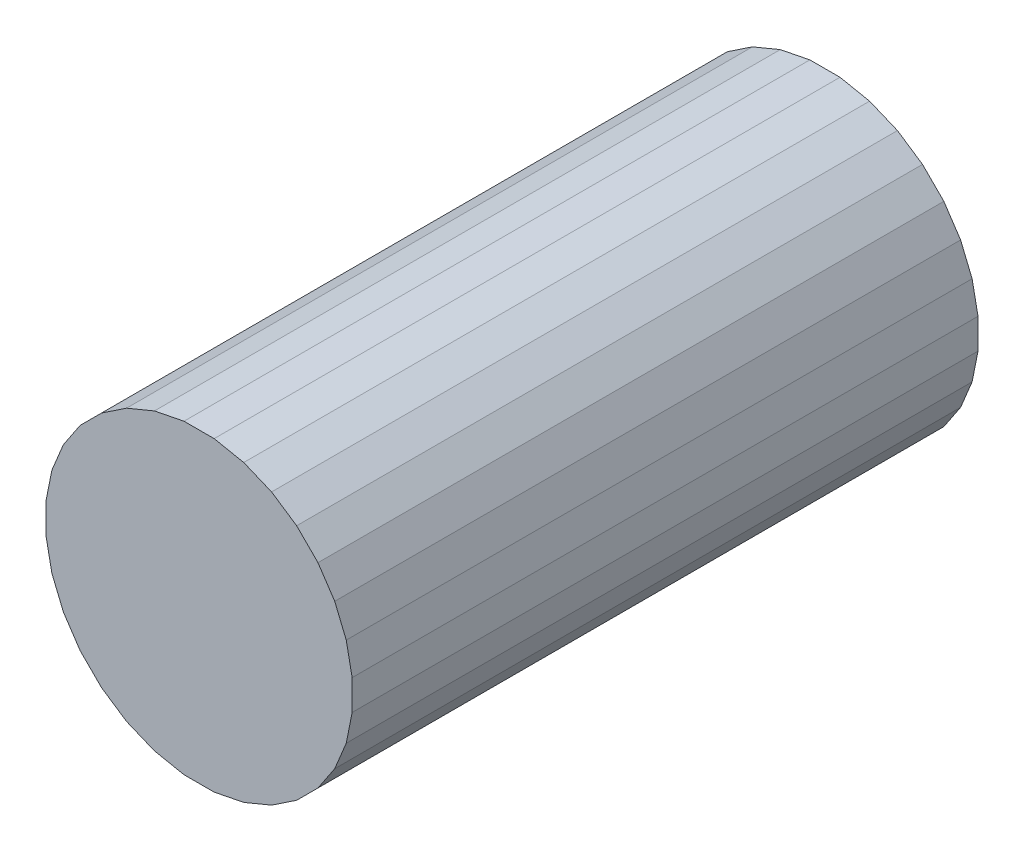
ISO-10303-21;
HEADER;
FILE_DESCRIPTION(('STEP AP214'),'2;1');
FILE_NAME('part.step','',(''),(''),'','','');
FILE_SCHEMA(('AUTOMOTIVE_DESIGN { 1 0 10303 214 1 1 1 1 }'));
ENDSEC;
DATA;
#1=APPLICATION_CONTEXT('core data for automotive mechanical design processes');
#2=APPLICATION_PROTOCOL_DEFINITION('international standard','automotive_design',2000,#1);
#3=PRODUCT_CONTEXT('',#1,'mechanical');
#4=PRODUCT('Part','Part','',(#3));
#5=PRODUCT_RELATED_PRODUCT_CATEGORY('part','',(#4));
#6=PRODUCT_DEFINITION_FORMATION('','',#4);
#7=PRODUCT_DEFINITION_CONTEXT('part definition',#1,'design');
#8=PRODUCT_DEFINITION('design','',#6,#7);
#9=PRODUCT_DEFINITION_SHAPE('','',#8);
#10=(LENGTH_UNIT() NAMED_UNIT(*) SI_UNIT(.MILLI.,.METRE.));
#11=(NAMED_UNIT(*) PLANE_ANGLE_UNIT() SI_UNIT($,.RADIAN.));
#12=(NAMED_UNIT(*) SI_UNIT($,.STERADIAN.) SOLID_ANGLE_UNIT());
#13=UNCERTAINTY_MEASURE_WITH_UNIT(LENGTH_MEASURE(1.E-05),#10,'distance_accuracy_value','');
#14=(GEOMETRIC_REPRESENTATION_CONTEXT(3) GLOBAL_UNCERTAINTY_ASSIGNED_CONTEXT((#13)) GLOBAL_UNIT_ASSIGNED_CONTEXT((#10,
#11,#12)) REPRESENTATION_CONTEXT('',''));
#15=CARTESIAN_POINT('',(0.,0.,0.));
#16=DIRECTION('',(0.,0.,1.));
#17=DIRECTION('',(1.,0.,0.));
#18=AXIS2_PLACEMENT_3D('',#15,#16,#17);
#19=CARTESIAN_POINT('',(-1.14949224,0.11321288,0.));
#20=DIRECTION('',(-0.980786364351914,0.195084872558983,0.));
#21=DIRECTION('',(-0.195084872558983,-0.980786364351914,0.));
#22=AXIS2_PLACEMENT_3D('',#19,#20,#21);
#23=PLANE('',#22);
#24=DIRECTION('',(0.,0.,1.));
#25=VECTOR('',#24,1.);
#26=CARTESIAN_POINT('',(-1.1053191,0.3352927,0.));
#27=LINE('',#26,#25);
#28=CARTESIAN_POINT('',(-1.10531909999999,0.335292699999998,0.));
#29=VERTEX_POINT('',#28);
#30=CARTESIAN_POINT('',(-1.10531909999999,0.335292699999998,4.69999822));
#31=VERTEX_POINT('',#30);
#32=EDGE_CURVE('E242',#29,#31,#27,.T.);
#33=ORIENTED_EDGE('',*,*,#32,.F.);
#34=DIRECTION('',(-0.195084872558983,-0.980786364351914,0.));
#35=VECTOR('',#34,1.);
#36=CARTESIAN_POINT('',(-1.14949224,0.11321288,0.));
#37=LINE('',#36,#35);
#38=CARTESIAN_POINT('',(-1.14949224,0.11321288,0.));
#39=VERTEX_POINT('',#38);
#40=EDGE_CURVE('E232',#29,#39,#37,.T.);
#41=ORIENTED_EDGE('',*,*,#40,.T.);
#42=DIRECTION('',(0.,0.,1.));
#43=VECTOR('',#42,1.);
#44=CARTESIAN_POINT('',(-1.14949224,0.11321288,0.));
#45=LINE('',#44,#43);
#46=CARTESIAN_POINT('',(-1.14949224,0.11321288,4.69999822));
#47=VERTEX_POINT('',#46);
#48=EDGE_CURVE('E19',#39,#47,#45,.T.);
#49=ORIENTED_EDGE('',*,*,#48,.T.);
#50=DIRECTION('',(-0.195084872558983,-0.980786364351914,0.));
#51=VECTOR('',#50,1.);
#52=CARTESIAN_POINT('',(-1.14949224,0.11321288,4.69999822));
#53=LINE('',#52,#51);
#54=EDGE_CURVE('E235',#47,#31,#53,.F.);
#55=ORIENTED_EDGE('',*,*,#54,.T.);
#56=EDGE_LOOP('',(#33,#41,#49,#55));
#57=FACE_BOUND('',#56,.T.);
#58=ADVANCED_FACE('F16',(#57),#23,.T.);
#59=CARTESIAN_POINT('',(-1.14949224,-0.11321542,0.));
#60=DIRECTION('',(-1.,0.,0.));
#61=DIRECTION('',(0.,0.,1.));
#62=AXIS2_PLACEMENT_3D('',#59,#60,#61);
#63=PLANE('',#62);
#64=DIRECTION('',(0.,1.,0.));
#65=VECTOR('',#64,1.);
#66=CARTESIAN_POINT('',(-1.14949224,-0.11321542,4.69999822));
#67=LINE('',#66,#65);
#68=CARTESIAN_POINT('',(-1.14949224,-0.113215420000001,4.69999822));
#69=VERTEX_POINT('',#68);
#70=EDGE_CURVE('E224',#69,#47,#67,.T.);
#71=ORIENTED_EDGE('',*,*,#70,.T.);
#72=ORIENTED_EDGE('',*,*,#48,.F.);
#73=DIRECTION('',(0.,1.,0.));
#74=VECTOR('',#73,1.);
#75=CARTESIAN_POINT('',(-1.14949224,-0.11321542,0.));
#76=LINE('',#75,#74);
#77=CARTESIAN_POINT('',(-1.14949224,-0.113215420000001,0.));
#78=VERTEX_POINT('',#77);
#79=EDGE_CURVE('E219',#39,#78,#76,.F.);
#80=ORIENTED_EDGE('',*,*,#79,.T.);
#81=DIRECTION('',(0.,0.,1.));
#82=VECTOR('',#81,1.);
#83=CARTESIAN_POINT('',(-1.14949224000001,-0.113215420000003,0.));
#84=LINE('',#83,#82);
#85=EDGE_CURVE('E230',#69,#78,#84,.F.);
#86=ORIENTED_EDGE('',*,*,#85,.F.);
#87=EDGE_LOOP('',(#71,#72,#80,#86));
#88=FACE_BOUND('',#87,.T.);
#89=ADVANCED_FACE('F226',(#88),#63,.T.);
#90=CARTESIAN_POINT('',(-1.1053191,0.3352927,0.));
#91=DIRECTION('',(-0.923878061104571,0.382686984635822,0.));
#92=DIRECTION('',(-0.382686984635822,-0.923878061104571,0.));
#93=AXIS2_PLACEMENT_3D('',#90,#91,#92);
#94=PLANE('',#93);
#95=DIRECTION('',(0.,0.,1.));
#96=VECTOR('',#95,1.);
#97=CARTESIAN_POINT('',(-1.018667,0.5444871,0.));
#98=LINE('',#97,#96);
#99=CARTESIAN_POINT('',(-1.01866699999997,0.544487099999989,0.));
#100=VERTEX_POINT('',#99);
#101=CARTESIAN_POINT('',(-1.01866699999997,0.544487099999989,4.69999822));
#102=VERTEX_POINT('',#101);
#103=EDGE_CURVE('E256',#100,#102,#98,.T.);
#104=ORIENTED_EDGE('',*,*,#103,.F.);
#105=DIRECTION('',(-0.382686984635822,-0.923878061104571,0.));
#106=VECTOR('',#105,1.);
#107=CARTESIAN_POINT('',(-1.1053191,0.3352927,0.));
#108=LINE('',#107,#106);
#109=EDGE_CURVE('E249',#100,#29,#108,.T.);
#110=ORIENTED_EDGE('',*,*,#109,.T.);
#111=ORIENTED_EDGE('',*,*,#32,.T.);
#112=DIRECTION('',(-0.382686984635822,-0.923878061104571,0.));
#113=VECTOR('',#112,1.);
#114=CARTESIAN_POINT('',(-1.1053191,0.3352927,4.69999822));
#115=LINE('',#114,#113);
#116=EDGE_CURVE('E238',#31,#102,#115,.F.);
#117=ORIENTED_EDGE('',*,*,#116,.T.);
#118=EDGE_LOOP('',(#104,#110,#111,#117));
#119=FACE_BOUND('',#118,.T.);
#120=ADVANCED_FACE('F537',(#119),#94,.T.);
#121=CARTESIAN_POINT('',(-1.1053191,-0.33529524,0.));
#122=DIRECTION('',(-0.980786364351914,-0.195084872558983,0.));
#123=DIRECTION('',(0.195084872558983,-0.980786364351914,0.));
#124=AXIS2_PLACEMENT_3D('',#121,#122,#123);
#125=PLANE('',#124);
#126=ORIENTED_EDGE('',*,*,#85,.T.);
#127=DIRECTION('',(0.195084872558983,-0.980786364351914,0.));
#128=VECTOR('',#127,1.);
#129=CARTESIAN_POINT('',(-1.1053191,-0.33529524,0.));
#130=LINE('',#129,#128);
#131=CARTESIAN_POINT('',(-1.10531910000001,-0.335295240000006,0.));
#132=VERTEX_POINT('',#131);
#133=EDGE_CURVE('E254',#78,#132,#130,.T.);
#134=ORIENTED_EDGE('',*,*,#133,.T.);
#135=DIRECTION('',(0.,0.,1.));
#136=VECTOR('',#135,1.);
#137=CARTESIAN_POINT('',(-1.10531910000006,-0.335295240000023,0.));
#138=LINE('',#137,#136);
#139=CARTESIAN_POINT('',(-1.10531910000001,-0.335295240000006,4.69999822));
#140=VERTEX_POINT('',#139);
#141=EDGE_CURVE('E267',#140,#132,#138,.F.);
#142=ORIENTED_EDGE('',*,*,#141,.F.);
#143=DIRECTION('',(0.195084872558983,-0.980786364351914,0.));
#144=VECTOR('',#143,1.);
#145=CARTESIAN_POINT('',(-1.1053191,-0.33529524,4.69999822));
#146=LINE('',#145,#144);
#147=EDGE_CURVE('E251',#140,#69,#146,.F.);
#148=ORIENTED_EDGE('',*,*,#147,.T.);
#149=EDGE_LOOP('',(#126,#134,#142,#148));
#150=FACE_BOUND('',#149,.T.);
#151=ADVANCED_FACE('F539',(#150),#125,.T.);
#152=CARTESIAN_POINT('',(-1.018667,0.5444871,0.));
#153=DIRECTION('',(-0.831473431321022,0.555564517412015,0.));
#154=DIRECTION('',(-0.555564517412015,-0.831473431321022,0.));
#155=AXIS2_PLACEMENT_3D('',#152,#153,#154);
#156=PLANE('',#155);
#157=DIRECTION('',(0.,0.,1.));
#158=VECTOR('',#157,1.);
#159=CARTESIAN_POINT('',(-0.89287096,0.73275698,0.));
#160=LINE('',#159,#158);
#161=CARTESIAN_POINT('',(-0.892870959999991,0.732756979999994,0.));
#162=VERTEX_POINT('',#161);
#163=CARTESIAN_POINT('',(-0.892870959999991,0.732756979999994,4.69999822));
#164=VERTEX_POINT('',#163);
#165=EDGE_CURVE('E272',#162,#164,#160,.T.);
#166=ORIENTED_EDGE('',*,*,#165,.F.);
#167=DIRECTION('',(-0.555564517412015,-0.831473431321022,0.));
#168=VECTOR('',#167,1.);
#169=CARTESIAN_POINT('',(-1.018667,0.5444871,0.));
#170=LINE('',#169,#168);
#171=EDGE_CURVE('E261',#162,#100,#170,.T.);
#172=ORIENTED_EDGE('',*,*,#171,.T.);
#173=ORIENTED_EDGE('',*,*,#103,.T.);
#174=DIRECTION('',(-0.555564517412015,-0.831473431321022,0.));
#175=VECTOR('',#174,1.);
#176=CARTESIAN_POINT('',(-1.018667,0.5444871,4.69999822));
#177=LINE('',#176,#175);
#178=EDGE_CURVE('E259',#102,#164,#177,.F.);
#179=ORIENTED_EDGE('',*,*,#178,.T.);
#180=EDGE_LOOP('',(#166,#172,#173,#179));
#181=FACE_BOUND('',#180,.T.);
#182=ADVANCED_FACE('F534',(#181),#156,.T.);
#183=CARTESIAN_POINT('',(-1.018667,-0.54448964,0.));
#184=DIRECTION('',(-0.923878061104571,-0.382686984635822,0.));
#185=DIRECTION('',(0.382686984635822,-0.923878061104571,0.));
#186=AXIS2_PLACEMENT_3D('',#183,#184,#185);
#187=PLANE('',#186);
#188=ORIENTED_EDGE('',*,*,#141,.T.);
#189=DIRECTION('',(0.382686984635822,-0.923878061104571,0.));
#190=VECTOR('',#189,1.);
#191=CARTESIAN_POINT('',(-1.018667,-0.54448964,0.));
#192=LINE('',#191,#190);
#193=CARTESIAN_POINT('',(-1.018667,-0.544489640000003,0.));
#194=VERTEX_POINT('',#193);
#195=EDGE_CURVE('E270',#132,#194,#192,.T.);
#196=ORIENTED_EDGE('',*,*,#195,.T.);
#197=DIRECTION('',(0.,0.,1.));
#198=VECTOR('',#197,1.);
#199=CARTESIAN_POINT('',(-1.01866700000002,-0.544489640000012,0.));
#200=LINE('',#199,#198);
#201=CARTESIAN_POINT('',(-1.018667,-0.544489640000003,4.69999822));
#202=VERTEX_POINT('',#201);
#203=EDGE_CURVE('E283',#202,#194,#200,.F.);
#204=ORIENTED_EDGE('',*,*,#203,.F.);
#205=DIRECTION('',(0.382686984635822,-0.923878061104571,0.));
#206=VECTOR('',#205,1.);
#207=CARTESIAN_POINT('',(-1.018667,-0.54448964,4.69999822));
#208=LINE('',#207,#206);
#209=EDGE_CURVE('E264',#202,#140,#208,.F.);
#210=ORIENTED_EDGE('',*,*,#209,.T.);
#211=EDGE_LOOP('',(#188,#196,#204,#210));
#212=FACE_BOUND('',#211,.T.);
#213=ADVANCED_FACE('F633',(#212),#187,.T.);
#214=CARTESIAN_POINT('',(-0.89287096,0.73275698,0.));
#215=DIRECTION('',(-0.707106781186548,0.707106781186548,0.));
#216=DIRECTION('',(-0.707106781186548,-0.707106781186548,0.));
#217=AXIS2_PLACEMENT_3D('',#214,#215,#216);
#218=PLANE('',#217);
#219=DIRECTION('',(0.,0.,1.));
#220=VECTOR('',#219,1.);
#221=CARTESIAN_POINT('',(-0.73275952,0.89286842,0.));
#222=LINE('',#221,#220);
#223=CARTESIAN_POINT('',(-0.73275952,0.89286842,0.));
#224=VERTEX_POINT('',#223);
#225=CARTESIAN_POINT('',(-0.73275952,0.89286842,4.69999822));
#226=VERTEX_POINT('',#225);
#227=EDGE_CURVE('E288',#224,#226,#222,.T.);
#228=ORIENTED_EDGE('',*,*,#227,.F.);
#229=DIRECTION('',(-0.707106781186548,-0.707106781186548,0.));
#230=VECTOR('',#229,1.);
#231=CARTESIAN_POINT('',(-0.89287096,0.73275698,0.));
#232=LINE('',#231,#230);
#233=EDGE_CURVE('E277',#224,#162,#232,.T.);
#234=ORIENTED_EDGE('',*,*,#233,.T.);
#235=ORIENTED_EDGE('',*,*,#165,.T.);
#236=DIRECTION('',(-0.707106781186548,-0.707106781186548,0.));
#237=VECTOR('',#236,1.);
#238=CARTESIAN_POINT('',(-0.89287096,0.73275698,4.69999822));
#239=LINE('',#238,#237);
#240=EDGE_CURVE('E275',#164,#226,#239,.F.);
#241=ORIENTED_EDGE('',*,*,#240,.T.);
#242=EDGE_LOOP('',(#228,#234,#235,#241));
#243=FACE_BOUND('',#242,.T.);
#244=ADVANCED_FACE('F531',(#243),#218,.T.);
#245=CARTESIAN_POINT('',(-0.89287096,-0.73275952,0.));
#246=DIRECTION('',(-0.831473431321022,-0.555564517412015,0.));
#247=DIRECTION('',(0.555564517412015,-0.831473431321022,0.));
#248=AXIS2_PLACEMENT_3D('',#245,#246,#247);
#249=PLANE('',#248);
#250=ORIENTED_EDGE('',*,*,#203,.T.);
#251=DIRECTION('',(0.555564517412015,-0.831473431321022,0.));
#252=VECTOR('',#251,1.);
#253=CARTESIAN_POINT('',(-0.89287096,-0.73275952,0.));
#254=LINE('',#253,#252);
#255=CARTESIAN_POINT('',(-0.89287096,-0.73275952,0.));
#256=VERTEX_POINT('',#255);
#257=EDGE_CURVE('E286',#194,#256,#254,.T.);
#258=ORIENTED_EDGE('',*,*,#257,.T.);
#259=DIRECTION('',(0.,0.,1.));
#260=VECTOR('',#259,1.);
#261=CARTESIAN_POINT('',(-0.89287096,-0.73275952,0.));
#262=LINE('',#261,#260);
#263=CARTESIAN_POINT('',(-0.89287096,-0.73275952,4.69999822));
#264=VERTEX_POINT('',#263);
#265=EDGE_CURVE('E299',#264,#256,#262,.F.);
#266=ORIENTED_EDGE('',*,*,#265,.F.);
#267=DIRECTION('',(0.555564517412015,-0.831473431321022,0.));
#268=VECTOR('',#267,1.);
#269=CARTESIAN_POINT('',(-0.89287096,-0.73275952,4.69999822));
#270=LINE('',#269,#268);
#271=EDGE_CURVE('E280',#264,#202,#270,.F.);
#272=ORIENTED_EDGE('',*,*,#271,.T.);
#273=EDGE_LOOP('',(#250,#258,#266,#272));
#274=FACE_BOUND('',#273,.T.);
#275=ADVANCED_FACE('F627',(#274),#249,.T.);
#276=CARTESIAN_POINT('',(-0.73275952,0.89286842,0.));
#277=DIRECTION('',(-0.555564517412015,0.831473431321022,0.));
#278=DIRECTION('',(-0.831473431321022,-0.555564517412015,0.));
#279=AXIS2_PLACEMENT_3D('',#276,#277,#278);
#280=PLANE('',#279);
#281=DIRECTION('',(0.,0.,1.));
#282=VECTOR('',#281,1.);
#283=CARTESIAN_POINT('',(-0.54448964,1.01866446,0.));
#284=LINE('',#283,#282);
#285=CARTESIAN_POINT('',(-0.544489640000006,1.01866446000001,0.));
#286=VERTEX_POINT('',#285);
#287=CARTESIAN_POINT('',(-0.544489640000006,1.01866446000001,4.69999822));
#288=VERTEX_POINT('',#287);
#289=EDGE_CURVE('E304',#286,#288,#284,.T.);
#290=ORIENTED_EDGE('',*,*,#289,.F.);
#291=DIRECTION('',(-0.831473431321022,-0.555564517412015,0.));
#292=VECTOR('',#291,1.);
#293=CARTESIAN_POINT('',(-0.73275952,0.89286842,0.));
#294=LINE('',#293,#292);
#295=EDGE_CURVE('E293',#286,#224,#294,.T.);
#296=ORIENTED_EDGE('',*,*,#295,.T.);
#297=ORIENTED_EDGE('',*,*,#227,.T.);
#298=DIRECTION('',(-0.831473431321022,-0.555564517412015,0.));
#299=VECTOR('',#298,1.);
#300=CARTESIAN_POINT('',(-0.73275952,0.89286842,4.69999822));
#301=LINE('',#300,#299);
#302=EDGE_CURVE('E291',#226,#288,#301,.F.);
#303=ORIENTED_EDGE('',*,*,#302,.T.);
#304=EDGE_LOOP('',(#290,#296,#297,#303));
#305=FACE_BOUND('',#304,.T.);
#306=ADVANCED_FACE('F529',(#305),#280,.T.);
#307=CARTESIAN_POINT('',(-0.73275952,-0.89287096,0.));
#308=DIRECTION('',(-0.707106781186548,-0.707106781186548,0.));
#309=DIRECTION('',(0.707106781186548,-0.707106781186548,0.));
#310=AXIS2_PLACEMENT_3D('',#307,#308,#309);
#311=PLANE('',#310);
#312=ORIENTED_EDGE('',*,*,#265,.T.);
#313=DIRECTION('',(0.707106781186548,-0.707106781186548,0.));
#314=VECTOR('',#313,1.);
#315=CARTESIAN_POINT('',(-0.73275952,-0.89287096,0.));
#316=LINE('',#315,#314);
#317=CARTESIAN_POINT('',(-0.732759519999997,-0.892870959999996,0.));
#318=VERTEX_POINT('',#317);
#319=EDGE_CURVE('E302',#256,#318,#316,.T.);
#320=ORIENTED_EDGE('',*,*,#319,.T.);
#321=DIRECTION('',(0.,0.,1.));
#322=VECTOR('',#321,1.);
#323=CARTESIAN_POINT('',(-0.732759519999988,-0.892870959999982,0.));
#324=LINE('',#323,#322);
#325=CARTESIAN_POINT('',(-0.732759519999996,-0.892870959999996,4.69999822));
#326=VERTEX_POINT('',#325);
#327=EDGE_CURVE('E315',#326,#318,#324,.F.);
#328=ORIENTED_EDGE('',*,*,#327,.F.);
#329=DIRECTION('',(0.707106781186548,-0.707106781186548,0.));
#330=VECTOR('',#329,1.);
#331=CARTESIAN_POINT('',(-0.73275952,-0.89287096,4.69999822));
#332=LINE('',#331,#330);
#333=EDGE_CURVE('E296',#326,#264,#332,.F.);
#334=ORIENTED_EDGE('',*,*,#333,.T.);
#335=EDGE_LOOP('',(#312,#320,#328,#334));
#336=FACE_BOUND('',#335,.T.);
#337=ADVANCED_FACE('F621',(#336),#311,.T.);
#338=CARTESIAN_POINT('',(-0.54448964,1.01866446,0.));
#339=DIRECTION('',(-0.382686984635822,0.923878061104571,0.));
#340=DIRECTION('',(-0.923878061104571,-0.382686984635822,0.));
#341=AXIS2_PLACEMENT_3D('',#338,#339,#340);
#342=PLANE('',#341);
#343=DIRECTION('',(0.,0.,1.));
#344=VECTOR('',#343,1.);
#345=CARTESIAN_POINT('',(-0.33529524,1.10531656,0.));
#346=LINE('',#345,#344);
#347=CARTESIAN_POINT('',(-0.335295240000012,1.10531656000003,0.));
#348=VERTEX_POINT('',#347);
#349=CARTESIAN_POINT('',(-0.335295240000012,1.10531656000003,4.69999822));
#350=VERTEX_POINT('',#349);
#351=EDGE_CURVE('E320',#348,#350,#346,.T.);
#352=ORIENTED_EDGE('',*,*,#351,.F.);
#353=DIRECTION('',(-0.923878061104571,-0.382686984635822,0.));
#354=VECTOR('',#353,1.);
#355=CARTESIAN_POINT('',(-0.54448964,1.01866446,0.));
#356=LINE('',#355,#354);
#357=EDGE_CURVE('E309',#348,#286,#356,.T.);
#358=ORIENTED_EDGE('',*,*,#357,.T.);
#359=ORIENTED_EDGE('',*,*,#289,.T.);
#360=DIRECTION('',(-0.923878061104571,-0.382686984635822,0.));
#361=VECTOR('',#360,1.);
#362=CARTESIAN_POINT('',(-0.54448964,1.01866446,4.69999822));
#363=LINE('',#362,#361);
#364=EDGE_CURVE('E307',#288,#350,#363,.F.);
#365=ORIENTED_EDGE('',*,*,#364,.T.);
#366=EDGE_LOOP('',(#352,#358,#359,#365));
#367=FACE_BOUND('',#366,.T.);
#368=ADVANCED_FACE('F524',(#367),#342,.T.);
#369=CARTESIAN_POINT('',(-0.54448964,-1.018667,0.));
#370=DIRECTION('',(-0.555564517412015,-0.831473431321022,0.));
#371=DIRECTION('',(0.831473431321022,-0.555564517412015,0.));
#372=AXIS2_PLACEMENT_3D('',#369,#370,#371);
#373=PLANE('',#372);
#374=ORIENTED_EDGE('',*,*,#327,.T.);
#375=DIRECTION('',(0.831473431321022,-0.555564517412015,0.));
#376=VECTOR('',#375,1.);
#377=CARTESIAN_POINT('',(-0.54448964,-1.018667,0.));
#378=LINE('',#377,#376);
#379=CARTESIAN_POINT('',(-0.544489639999994,-1.01866699999999,0.));
#380=VERTEX_POINT('',#379);
#381=EDGE_CURVE('E318',#318,#380,#378,.T.);
#382=ORIENTED_EDGE('',*,*,#381,.T.);
#383=DIRECTION('',(0.,0.,1.));
#384=VECTOR('',#383,1.);
#385=CARTESIAN_POINT('',(-0.544489639999977,-1.01866699999994,0.));
#386=LINE('',#385,#384);
#387=CARTESIAN_POINT('',(-0.544489639999994,-1.01866699999999,4.69999822));
#388=VERTEX_POINT('',#387);
#389=EDGE_CURVE('E332',#388,#380,#386,.F.);
#390=ORIENTED_EDGE('',*,*,#389,.F.);
#391=DIRECTION('',(0.831473431321022,-0.555564517412015,0.));
#392=VECTOR('',#391,1.);
#393=CARTESIAN_POINT('',(-0.54448964,-1.018667,4.69999822));
#394=LINE('',#393,#392);
#395=EDGE_CURVE('E312',#388,#326,#394,.F.);
#396=ORIENTED_EDGE('',*,*,#395,.T.);
#397=EDGE_LOOP('',(#374,#382,#390,#396));
#398=FACE_BOUND('',#397,.T.);
#399=ADVANCED_FACE('F615',(#398),#373,.T.);
#400=CARTESIAN_POINT('',(-0.33529524,1.10531656,0.));
#401=DIRECTION('',(-0.195095663179916,0.980784217964578,0.));
#402=DIRECTION('',(-0.980784217964578,-0.195095663179916,0.));
#403=AXIS2_PLACEMENT_3D('',#400,#401,#402);
#404=PLANE('',#403);
#405=DIRECTION('',(0.,0.,1.));
#406=VECTOR('',#405,1.);
#407=CARTESIAN_POINT('',(-0.11321542,1.14949224,0.));
#408=LINE('',#407,#406);
#409=CARTESIAN_POINT('',(-0.113215419999991,1.14949223999996,0.));
#410=VERTEX_POINT('',#409);
#411=CARTESIAN_POINT('',(-0.113215419999991,1.14949223999996,4.69999822));
#412=VERTEX_POINT('',#411);
#413=EDGE_CURVE('E337',#410,#412,#408,.T.);
#414=ORIENTED_EDGE('',*,*,#413,.F.);
#415=DIRECTION('',(-0.980784217964578,-0.195095663179916,0.));
#416=VECTOR('',#415,1.);
#417=CARTESIAN_POINT('',(-0.33529524,1.10531656,0.));
#418=LINE('',#417,#416);
#419=EDGE_CURVE('E326',#410,#348,#418,.T.);
#420=ORIENTED_EDGE('',*,*,#419,.T.);
#421=ORIENTED_EDGE('',*,*,#351,.T.);
#422=DIRECTION('',(-0.980784217964578,-0.195095663179916,0.));
#423=VECTOR('',#422,1.);
#424=CARTESIAN_POINT('',(-0.33529524,1.10531656,4.69999822));
#425=LINE('',#424,#423);
#426=EDGE_CURVE('E323',#350,#412,#425,.F.);
#427=ORIENTED_EDGE('',*,*,#426,.T.);
#428=EDGE_LOOP('',(#414,#420,#421,#427));
#429=FACE_BOUND('',#428,.T.);
#430=ADVANCED_FACE('F518',(#429),#404,.T.);
#431=CARTESIAN_POINT('',(-0.33529524,-1.1053191,0.));
#432=DIRECTION('',(-0.382686984635822,-0.923878061104571,0.));
#433=DIRECTION('',(0.923878061104571,-0.382686984635822,0.));
#434=AXIS2_PLACEMENT_3D('',#431,#432,#433);
#435=PLANE('',#434);
#436=ORIENTED_EDGE('',*,*,#389,.T.);
#437=DIRECTION('',(0.923878061104571,-0.382686984635822,0.));
#438=VECTOR('',#437,1.);
#439=CARTESIAN_POINT('',(-0.33529524,-1.1053191,0.));
#440=LINE('',#439,#438);
#441=CARTESIAN_POINT('',(-0.33529524,-1.1053191,0.));
#442=VERTEX_POINT('',#441);
#443=EDGE_CURVE('E335',#380,#442,#440,.T.);
#444=ORIENTED_EDGE('',*,*,#443,.T.);
#445=DIRECTION('',(0.,0.,1.));
#446=VECTOR('',#445,1.);
#447=CARTESIAN_POINT('',(-0.335295239999997,-1.10531909999999,0.));
#448=LINE('',#447,#446);
#449=CARTESIAN_POINT('',(-0.33529524,-1.1053191,4.69999822));
#450=VERTEX_POINT('',#449);
#451=EDGE_CURVE('E343',#450,#442,#448,.F.);
#452=ORIENTED_EDGE('',*,*,#451,.F.);
#453=DIRECTION('',(0.923878061104571,-0.382686984635822,0.));
#454=VECTOR('',#453,1.);
#455=CARTESIAN_POINT('',(-0.33529524,-1.1053191,4.69999822));
#456=LINE('',#455,#454);
#457=EDGE_CURVE('E329',#450,#388,#456,.F.);
#458=ORIENTED_EDGE('',*,*,#457,.T.);
#459=EDGE_LOOP('',(#436,#444,#452,#458));
#460=FACE_BOUND('',#459,.T.);
#461=ADVANCED_FACE('F608',(#460),#435,.T.);
#462=CARTESIAN_POINT('',(-0.11321542,-1.14949224,0.));
#463=DIRECTION('',(-0.195084872558983,-0.980786364351914,0.));
#464=DIRECTION('',(0.980786364351914,-0.195084872558983,0.));
#465=AXIS2_PLACEMENT_3D('',#462,#463,#464);
#466=PLANE('',#465);
#467=ORIENTED_EDGE('',*,*,#451,.T.);
#468=DIRECTION('',(0.980786364351914,-0.195084872558983,0.));
#469=VECTOR('',#468,1.);
#470=CARTESIAN_POINT('',(-0.11321542,-1.14949224,0.));
#471=LINE('',#470,#469);
#472=CARTESIAN_POINT('',(-0.11321542,-1.14949224,0.));
#473=VERTEX_POINT('',#472);
#474=EDGE_CURVE('E346',#442,#473,#471,.T.);
#475=ORIENTED_EDGE('',*,*,#474,.T.);
#476=DIRECTION('',(0.,0.,-1.));
#477=VECTOR('',#476,1.);
#478=CARTESIAN_POINT('',(-0.11321542,-1.14949224,0.));
#479=LINE('',#478,#477);
#480=CARTESIAN_POINT('',(-0.113215420000001,-1.14949224,4.69999822));
#481=VERTEX_POINT('',#480);
#482=EDGE_CURVE('E353',#481,#473,#479,.T.);
#483=ORIENTED_EDGE('',*,*,#482,.F.);
#484=DIRECTION('',(0.980786364351914,-0.195084872558983,0.));
#485=VECTOR('',#484,1.);
#486=CARTESIAN_POINT('',(-0.11321542,-1.14949224,4.69999822));
#487=LINE('',#486,#485);
#488=EDGE_CURVE('E340',#481,#450,#487,.F.);
#489=ORIENTED_EDGE('',*,*,#488,.T.);
#490=EDGE_LOOP('',(#467,#475,#483,#489));
#491=FACE_BOUND('',#490,.T.);
#492=ADVANCED_FACE('F605',(#491),#466,.T.);
#493=CARTESIAN_POINT('',(0.,1.14949224,0.));
#494=DIRECTION('',(0.,1.,0.));
#495=DIRECTION('',(0.,0.,1.));
#496=AXIS2_PLACEMENT_3D('',#493,#494,#495);
#497=PLANE('',#496);
#498=DIRECTION('',(0.,0.,1.));
#499=VECTOR('',#498,1.);
#500=CARTESIAN_POINT('',(0.11321288,1.14949224,0.));
#501=LINE('',#500,#499);
#502=CARTESIAN_POINT('',(0.11321288,1.14949224,0.));
#503=VERTEX_POINT('',#502);
#504=CARTESIAN_POINT('',(0.11321288,1.14949224,4.69999822));
#505=VERTEX_POINT('',#504);
#506=EDGE_CURVE('E356',#503,#505,#501,.T.);
#507=ORIENTED_EDGE('',*,*,#506,.F.);
#508=DIRECTION('',(1.,0.,0.));
#509=VECTOR('',#508,1.);
#510=CARTESIAN_POINT('',(0.,1.14949224,0.));
#511=LINE('',#510,#509);
#512=EDGE_CURVE('E351',#503,#410,#511,.F.);
#513=ORIENTED_EDGE('',*,*,#512,.T.);
#514=ORIENTED_EDGE('',*,*,#413,.T.);
#515=DIRECTION('',(1.,0.,0.));
#516=VECTOR('',#515,1.);
#517=CARTESIAN_POINT('',(0.,1.14949224,4.69999822));
#518=LINE('',#517,#516);
#519=EDGE_CURVE('E349',#412,#505,#518,.T.);
#520=ORIENTED_EDGE('',*,*,#519,.T.);
#521=EDGE_LOOP('',(#507,#513,#514,#520));
#522=FACE_BOUND('',#521,.T.);
#523=ADVANCED_FACE('F520',(#522),#497,.T.);
#524=CARTESIAN_POINT('',(0.11321288,1.14949224,0.));
#525=DIRECTION('',(0.195095663179916,0.980784217964578,0.));
#526=DIRECTION('',(-0.980784217964578,0.195095663179916,0.));
#527=AXIS2_PLACEMENT_3D('',#524,#525,#526);
#528=PLANE('',#527);
#529=DIRECTION('',(0.,0.,1.));
#530=VECTOR('',#529,1.);
#531=CARTESIAN_POINT('',(0.3352927,1.10531656,0.));
#532=LINE('',#531,#530);
#533=CARTESIAN_POINT('',(0.335292700000008,1.10531656000004,0.));
#534=VERTEX_POINT('',#533);
#535=CARTESIAN_POINT('',(0.335292700000008,1.10531656000004,4.69999822));
#536=VERTEX_POINT('',#535);
#537=EDGE_CURVE('E368',#534,#536,#532,.T.);
#538=ORIENTED_EDGE('',*,*,#537,.F.);
#539=DIRECTION('',(-0.980784217964578,0.195095663179916,0.));
#540=VECTOR('',#539,1.);
#541=CARTESIAN_POINT('',(0.11321288,1.14949224,0.));
#542=LINE('',#541,#540);
#543=EDGE_CURVE('E361',#534,#503,#542,.T.);
#544=ORIENTED_EDGE('',*,*,#543,.T.);
#545=ORIENTED_EDGE('',*,*,#506,.T.);
#546=DIRECTION('',(-0.980784217964578,0.195095663179916,0.));
#547=VECTOR('',#546,1.);
#548=CARTESIAN_POINT('',(0.11321288,1.14949224,4.69999822));
#549=LINE('',#548,#547);
#550=EDGE_CURVE('E359',#505,#536,#549,.F.);
#551=ORIENTED_EDGE('',*,*,#550,.T.);
#552=EDGE_LOOP('',(#538,#544,#545,#551));
#553=FACE_BOUND('',#552,.T.);
#554=ADVANCED_FACE('F511',(#553),#528,.T.);
#555=CARTESIAN_POINT('',(0.11321288,-1.14949224,0.));
#556=DIRECTION('',(0.,-1.,0.));
#557=DIRECTION('',(0.,0.,-1.));
#558=AXIS2_PLACEMENT_3D('',#555,#556,#557);
#559=PLANE('',#558);
#560=DIRECTION('',(1.,0.,0.));
#561=VECTOR('',#560,1.);
#562=CARTESIAN_POINT('',(0.11321288,-1.14949224,4.69999822));
#563=LINE('',#562,#561);
#564=CARTESIAN_POINT('',(0.113212879999996,-1.14949224,4.69999822));
#565=VERTEX_POINT('',#564);
#566=EDGE_CURVE('E364',#565,#481,#563,.F.);
#567=ORIENTED_EDGE('',*,*,#566,.T.);
#568=ORIENTED_EDGE('',*,*,#482,.T.);
#569=DIRECTION('',(1.,0.,0.));
#570=VECTOR('',#569,1.);
#571=CARTESIAN_POINT('',(0.11321288,-1.14949224,0.));
#572=LINE('',#571,#570);
#573=CARTESIAN_POINT('',(0.113212879999999,-1.14949224,0.));
#574=VERTEX_POINT('',#573);
#575=EDGE_CURVE('E366',#473,#574,#572,.T.);
#576=ORIENTED_EDGE('',*,*,#575,.T.);
#577=DIRECTION('',(0.,0.,1.));
#578=VECTOR('',#577,1.);
#579=CARTESIAN_POINT('',(0.113212880000003,-1.14949224000001,0.));
#580=LINE('',#579,#578);
#581=EDGE_CURVE('E379',#565,#574,#580,.F.);
#582=ORIENTED_EDGE('',*,*,#581,.F.);
#583=EDGE_LOOP('',(#567,#568,#576,#582));
#584=FACE_BOUND('',#583,.T.);
#585=ADVANCED_FACE('F597',(#584),#559,.T.);
#586=CARTESIAN_POINT('',(0.3352927,1.10531656,0.));
#587=DIRECTION('',(0.382686984635822,0.923878061104571,0.));
#588=DIRECTION('',(-0.923878061104571,0.382686984635822,0.));
#589=AXIS2_PLACEMENT_3D('',#586,#587,#588);
#590=PLANE('',#589);
#591=DIRECTION('',(0.,0.,1.));
#592=VECTOR('',#591,1.);
#593=CARTESIAN_POINT('',(0.5444871,1.01866446,0.));
#594=LINE('',#593,#592);
#595=CARTESIAN_POINT('',(0.544487099999989,1.01866445999997,0.));
#596=VERTEX_POINT('',#595);
#597=CARTESIAN_POINT('',(0.544487099999989,1.01866445999997,4.69999822));
#598=VERTEX_POINT('',#597);
#599=EDGE_CURVE('E384',#596,#598,#594,.T.);
#600=ORIENTED_EDGE('',*,*,#599,.F.);
#601=DIRECTION('',(-0.923878061104571,0.382686984635822,0.));
#602=VECTOR('',#601,1.);
#603=CARTESIAN_POINT('',(0.3352927,1.10531656,0.));
#604=LINE('',#603,#602);
#605=EDGE_CURVE('E373',#596,#534,#604,.T.);
#606=ORIENTED_EDGE('',*,*,#605,.T.);
#607=ORIENTED_EDGE('',*,*,#537,.T.);
#608=DIRECTION('',(-0.923878061104571,0.382686984635822,0.));
#609=VECTOR('',#608,1.);
#610=CARTESIAN_POINT('',(0.3352927,1.10531656,4.69999822));
#611=LINE('',#610,#609);
#612=EDGE_CURVE('E371',#536,#598,#611,.F.);
#613=ORIENTED_EDGE('',*,*,#612,.T.);
#614=EDGE_LOOP('',(#600,#606,#607,#613));
#615=FACE_BOUND('',#614,.T.);
#616=ADVANCED_FACE('F508',(#615),#590,.T.);
#617=CARTESIAN_POINT('',(0.3352927,-1.1053191,0.));
#618=DIRECTION('',(0.195084872558983,-0.980786364351914,0.));
#619=DIRECTION('',(0.980786364351914,0.195084872558983,0.));
#620=AXIS2_PLACEMENT_3D('',#617,#618,#619);
#621=PLANE('',#620);
#622=ORIENTED_EDGE('',*,*,#581,.T.);
#623=DIRECTION('',(0.980786364351914,0.195084872558983,0.));
#624=VECTOR('',#623,1.);
#625=CARTESIAN_POINT('',(0.3352927,-1.1053191,0.));
#626=LINE('',#625,#624);
#627=CARTESIAN_POINT('',(0.335292700000006,-1.10531910000001,0.));
#628=VERTEX_POINT('',#627);
#629=EDGE_CURVE('E382',#574,#628,#626,.T.);
#630=ORIENTED_EDGE('',*,*,#629,.T.);
#631=DIRECTION('',(0.,0.,1.));
#632=VECTOR('',#631,1.);
#633=CARTESIAN_POINT('',(0.335292700000023,-1.10531910000006,0.));
#634=LINE('',#633,#632);
#635=CARTESIAN_POINT('',(0.335292700000006,-1.10531910000001,4.69999822));
#636=VERTEX_POINT('',#635);
#637=EDGE_CURVE('E395',#636,#628,#634,.F.);
#638=ORIENTED_EDGE('',*,*,#637,.F.);
#639=DIRECTION('',(0.980786364351914,0.195084872558983,0.));
#640=VECTOR('',#639,1.);
#641=CARTESIAN_POINT('',(0.3352927,-1.1053191,4.69999822));
#642=LINE('',#641,#640);
#643=EDGE_CURVE('E376',#636,#565,#642,.F.);
#644=ORIENTED_EDGE('',*,*,#643,.T.);
#645=EDGE_LOOP('',(#622,#630,#638,#644));
#646=FACE_BOUND('',#645,.T.);
#647=ADVANCED_FACE('F591',(#646),#621,.T.);
#648=CARTESIAN_POINT('',(0.5444871,1.01866446,0.));
#649=DIRECTION('',(0.555564517412015,0.831473431321022,0.));
#650=DIRECTION('',(-0.831473431321022,0.555564517412015,0.));
#651=AXIS2_PLACEMENT_3D('',#648,#649,#650);
#652=PLANE('',#651);
#653=DIRECTION('',(0.,0.,1.));
#654=VECTOR('',#653,1.);
#655=CARTESIAN_POINT('',(0.73275698,0.89286842,0.));
#656=LINE('',#655,#654);
#657=CARTESIAN_POINT('',(0.732756979999994,0.892868419999991,0.));
#658=VERTEX_POINT('',#657);
#659=CARTESIAN_POINT('',(0.732756979999994,0.892868419999991,4.69999822));
#660=VERTEX_POINT('',#659);
#661=EDGE_CURVE('E400',#658,#660,#656,.T.);
#662=ORIENTED_EDGE('',*,*,#661,.F.);
#663=DIRECTION('',(-0.831473431321022,0.555564517412015,0.));
#664=VECTOR('',#663,1.);
#665=CARTESIAN_POINT('',(0.5444871,1.01866446,0.));
#666=LINE('',#665,#664);
#667=EDGE_CURVE('E389',#658,#596,#666,.T.);
#668=ORIENTED_EDGE('',*,*,#667,.T.);
#669=ORIENTED_EDGE('',*,*,#599,.T.);
#670=DIRECTION('',(-0.831473431321022,0.555564517412015,0.));
#671=VECTOR('',#670,1.);
#672=CARTESIAN_POINT('',(0.5444871,1.01866446,4.69999822));
#673=LINE('',#672,#671);
#674=EDGE_CURVE('E387',#598,#660,#673,.F.);
#675=ORIENTED_EDGE('',*,*,#674,.T.);
#676=EDGE_LOOP('',(#662,#668,#669,#675));
#677=FACE_BOUND('',#676,.T.);
#678=ADVANCED_FACE('F506',(#677),#652,.T.);
#679=CARTESIAN_POINT('',(0.5444871,-1.018667,0.));
#680=DIRECTION('',(0.382686984635822,-0.923878061104571,0.));
#681=DIRECTION('',(0.923878061104571,0.382686984635822,0.));
#682=AXIS2_PLACEMENT_3D('',#679,#680,#681);
#683=PLANE('',#682);
#684=ORIENTED_EDGE('',*,*,#637,.T.);
#685=DIRECTION('',(0.923878061104571,0.382686984635822,0.));
#686=VECTOR('',#685,1.);
#687=CARTESIAN_POINT('',(0.5444871,-1.018667,0.));
#688=LINE('',#687,#686);
#689=CARTESIAN_POINT('',(0.544487100000003,-1.018667,0.));
#690=VERTEX_POINT('',#689);
#691=EDGE_CURVE('E398',#628,#690,#688,.T.);
#692=ORIENTED_EDGE('',*,*,#691,.T.);
#693=DIRECTION('',(0.,0.,1.));
#694=VECTOR('',#693,1.);
#695=CARTESIAN_POINT('',(0.544487100000012,-1.01866700000002,0.));
#696=LINE('',#695,#694);
#697=CARTESIAN_POINT('',(0.544487100000004,-1.018667,4.69999822));
#698=VERTEX_POINT('',#697);
#699=EDGE_CURVE('E411',#698,#690,#696,.F.);
#700=ORIENTED_EDGE('',*,*,#699,.F.);
#701=DIRECTION('',(0.923878061104571,0.382686984635822,0.));
#702=VECTOR('',#701,1.);
#703=CARTESIAN_POINT('',(0.5444871,-1.018667,4.69999822));
#704=LINE('',#703,#702);
#705=EDGE_CURVE('E392',#698,#636,#704,.F.);
#706=ORIENTED_EDGE('',*,*,#705,.T.);
#707=EDGE_LOOP('',(#684,#692,#700,#706));
#708=FACE_BOUND('',#707,.T.);
#709=ADVANCED_FACE('F585',(#708),#683,.T.);
#710=CARTESIAN_POINT('',(0.73275698,0.89286842,0.));
#711=DIRECTION('',(0.707106781186548,0.707106781186548,0.));
#712=DIRECTION('',(-0.707106781186548,0.707106781186548,0.));
#713=AXIS2_PLACEMENT_3D('',#710,#711,#712);
#714=PLANE('',#713);
#715=DIRECTION('',(0.,0.,1.));
#716=VECTOR('',#715,1.);
#717=CARTESIAN_POINT('',(0.89286842,0.73275698,0.));
#718=LINE('',#717,#716);
#719=CARTESIAN_POINT('',(0.89286842,0.73275698,0.));
#720=VERTEX_POINT('',#719);
#721=CARTESIAN_POINT('',(0.89286842,0.73275698,4.69999822));
#722=VERTEX_POINT('',#721);
#723=EDGE_CURVE('E416',#720,#722,#718,.T.);
#724=ORIENTED_EDGE('',*,*,#723,.F.);
#725=DIRECTION('',(-0.707106781186548,0.707106781186548,0.));
#726=VECTOR('',#725,1.);
#727=CARTESIAN_POINT('',(0.73275698,0.89286842,0.));
#728=LINE('',#727,#726);
#729=EDGE_CURVE('E405',#720,#658,#728,.T.);
#730=ORIENTED_EDGE('',*,*,#729,.T.);
#731=ORIENTED_EDGE('',*,*,#661,.T.);
#732=DIRECTION('',(-0.707106781186548,0.707106781186548,0.));
#733=VECTOR('',#732,1.);
#734=CARTESIAN_POINT('',(0.73275698,0.89286842,4.69999822));
#735=LINE('',#734,#733);
#736=EDGE_CURVE('E403',#660,#722,#735,.F.);
#737=ORIENTED_EDGE('',*,*,#736,.T.);
#738=EDGE_LOOP('',(#724,#730,#731,#737));
#739=FACE_BOUND('',#738,.T.);
#740=ADVANCED_FACE('F499',(#739),#714,.T.);
#741=CARTESIAN_POINT('',(0.73275698,-0.89287096,0.));
#742=DIRECTION('',(0.555564517412015,-0.831473431321022,0.));
#743=DIRECTION('',(0.831473431321022,0.555564517412015,0.));
#744=AXIS2_PLACEMENT_3D('',#741,#742,#743);
#745=PLANE('',#744);
#746=ORIENTED_EDGE('',*,*,#699,.T.);
#747=DIRECTION('',(0.831473431321022,0.555564517412015,0.));
#748=VECTOR('',#747,1.);
#749=CARTESIAN_POINT('',(0.73275698,-0.89287096,0.));
#750=LINE('',#749,#748);
#751=CARTESIAN_POINT('',(0.73275698,-0.89287096,0.));
#752=VERTEX_POINT('',#751);
#753=EDGE_CURVE('E414',#690,#752,#750,.T.);
#754=ORIENTED_EDGE('',*,*,#753,.T.);
#755=DIRECTION('',(0.,0.,1.));
#756=VECTOR('',#755,1.);
#757=CARTESIAN_POINT('',(0.73275698,-0.89287096,0.));
#758=LINE('',#757,#756);
#759=CARTESIAN_POINT('',(0.73275698,-0.89287096,4.69999822));
#760=VERTEX_POINT('',#759);
#761=EDGE_CURVE('E427',#760,#752,#758,.F.);
#762=ORIENTED_EDGE('',*,*,#761,.F.);
#763=DIRECTION('',(0.831473431321022,0.555564517412015,0.));
#764=VECTOR('',#763,1.);
#765=CARTESIAN_POINT('',(0.73275698,-0.89287096,4.69999822));
#766=LINE('',#765,#764);
#767=EDGE_CURVE('E408',#760,#698,#766,.F.);
#768=ORIENTED_EDGE('',*,*,#767,.T.);
#769=EDGE_LOOP('',(#746,#754,#762,#768));
#770=FACE_BOUND('',#769,.T.);
#771=ADVANCED_FACE('F579',(#770),#745,.T.);
#772=CARTESIAN_POINT('',(0.89286842,0.73275698,0.));
#773=DIRECTION('',(0.831473431321022,0.555564517412015,0.));
#774=DIRECTION('',(-0.555564517412015,0.831473431321022,0.));
#775=AXIS2_PLACEMENT_3D('',#772,#773,#774);
#776=PLANE('',#775);
#777=DIRECTION('',(0.,0.,1.));
#778=VECTOR('',#777,1.);
#779=CARTESIAN_POINT('',(1.01866446,0.5444871,0.));
#780=LINE('',#779,#778);
#781=CARTESIAN_POINT('',(1.01866446000001,0.544487100000006,0.));
#782=VERTEX_POINT('',#781);
#783=CARTESIAN_POINT('',(1.01866446000001,0.544487100000006,4.69999822));
#784=VERTEX_POINT('',#783);
#785=EDGE_CURVE('E432',#782,#784,#780,.T.);
#786=ORIENTED_EDGE('',*,*,#785,.F.);
#787=DIRECTION('',(-0.555564517412015,0.831473431321022,0.));
#788=VECTOR('',#787,1.);
#789=CARTESIAN_POINT('',(0.89286842,0.73275698,0.));
#790=LINE('',#789,#788);
#791=EDGE_CURVE('E421',#782,#720,#790,.T.);
#792=ORIENTED_EDGE('',*,*,#791,.T.);
#793=ORIENTED_EDGE('',*,*,#723,.T.);
#794=DIRECTION('',(-0.555564517412015,0.831473431321022,0.));
#795=VECTOR('',#794,1.);
#796=CARTESIAN_POINT('',(0.89286842,0.73275698,4.69999822));
#797=LINE('',#796,#795);
#798=EDGE_CURVE('E419',#722,#784,#797,.F.);
#799=ORIENTED_EDGE('',*,*,#798,.T.);
#800=EDGE_LOOP('',(#786,#792,#793,#799));
#801=FACE_BOUND('',#800,.T.);
#802=ADVANCED_FACE('F496',(#801),#776,.T.);
#803=CARTESIAN_POINT('',(0.89286842,-0.73275952,0.));
#804=DIRECTION('',(0.707106781186548,-0.707106781186548,0.));
#805=DIRECTION('',(0.707106781186548,0.707106781186548,0.));
#806=AXIS2_PLACEMENT_3D('',#803,#804,#805);
#807=PLANE('',#806);
#808=ORIENTED_EDGE('',*,*,#761,.T.);
#809=DIRECTION('',(0.707106781186548,0.707106781186548,0.));
#810=VECTOR('',#809,1.);
#811=CARTESIAN_POINT('',(0.89286842,-0.73275952,0.));
#812=LINE('',#811,#810);
#813=CARTESIAN_POINT('',(0.892868419999996,-0.732759519999997,0.));
#814=VERTEX_POINT('',#813);
#815=EDGE_CURVE('E430',#752,#814,#812,.T.);
#816=ORIENTED_EDGE('',*,*,#815,.T.);
#817=DIRECTION('',(0.,0.,1.));
#818=VECTOR('',#817,1.);
#819=CARTESIAN_POINT('',(0.892868419999982,-0.732759519999988,0.));
#820=LINE('',#819,#818);
#821=CARTESIAN_POINT('',(0.892868419999996,-0.732759519999996,4.69999822));
#822=VERTEX_POINT('',#821);
#823=EDGE_CURVE('E443',#822,#814,#820,.F.);
#824=ORIENTED_EDGE('',*,*,#823,.F.);
#825=DIRECTION('',(0.707106781186548,0.707106781186548,0.));
#826=VECTOR('',#825,1.);
#827=CARTESIAN_POINT('',(0.89286842,-0.73275952,4.69999822));
#828=LINE('',#827,#826);
#829=EDGE_CURVE('E424',#822,#760,#828,.F.);
#830=ORIENTED_EDGE('',*,*,#829,.T.);
#831=EDGE_LOOP('',(#808,#816,#824,#830));
#832=FACE_BOUND('',#831,.T.);
#833=ADVANCED_FACE('F573',(#832),#807,.T.);
#834=CARTESIAN_POINT('',(1.01866446,0.5444871,0.));
#835=DIRECTION('',(0.923878061104571,0.382686984635822,0.));
#836=DIRECTION('',(-0.382686984635822,0.923878061104571,0.));
#837=AXIS2_PLACEMENT_3D('',#834,#835,#836);
#838=PLANE('',#837);
#839=DIRECTION('',(0.,0.,1.));
#840=VECTOR('',#839,1.);
#841=CARTESIAN_POINT('',(1.10531656,0.3352927,0.));
#842=LINE('',#841,#840);
#843=CARTESIAN_POINT('',(1.10531656000003,0.335292700000011,0.));
#844=VERTEX_POINT('',#843);
#845=CARTESIAN_POINT('',(1.10531656000003,0.335292700000011,4.69999822));
#846=VERTEX_POINT('',#845);
#847=EDGE_CURVE('E448',#844,#846,#842,.T.);
#848=ORIENTED_EDGE('',*,*,#847,.F.);
#849=DIRECTION('',(-0.382686984635822,0.923878061104571,0.));
#850=VECTOR('',#849,1.);
#851=CARTESIAN_POINT('',(1.01866446,0.5444871,0.));
#852=LINE('',#851,#850);
#853=EDGE_CURVE('E437',#844,#782,#852,.T.);
#854=ORIENTED_EDGE('',*,*,#853,.T.);
#855=ORIENTED_EDGE('',*,*,#785,.T.);
#856=DIRECTION('',(-0.382686984635822,0.923878061104571,0.));
#857=VECTOR('',#856,1.);
#858=CARTESIAN_POINT('',(1.01866446,0.5444871,4.69999822));
#859=LINE('',#858,#857);
#860=EDGE_CURVE('E435',#784,#846,#859,.F.);
#861=ORIENTED_EDGE('',*,*,#860,.T.);
#862=EDGE_LOOP('',(#848,#854,#855,#861));
#863=FACE_BOUND('',#862,.T.);
#864=ADVANCED_FACE('F494',(#863),#838,.T.);
#865=CARTESIAN_POINT('',(1.01866446,-0.54448964,0.));
#866=DIRECTION('',(0.831473431321022,-0.555564517412015,0.));
#867=DIRECTION('',(0.555564517412015,0.831473431321022,0.));
#868=AXIS2_PLACEMENT_3D('',#865,#866,#867);
#869=PLANE('',#868);
#870=ORIENTED_EDGE('',*,*,#823,.T.);
#871=DIRECTION('',(0.555564517412015,0.831473431321022,0.));
#872=VECTOR('',#871,1.);
#873=CARTESIAN_POINT('',(1.01866446,-0.54448964,0.));
#874=LINE('',#873,#872);
#875=CARTESIAN_POINT('',(1.01866445999999,-0.544489639999995,0.));
#876=VERTEX_POINT('',#875);
#877=EDGE_CURVE('E446',#814,#876,#874,.T.);
#878=ORIENTED_EDGE('',*,*,#877,.T.);
#879=DIRECTION('',(0.,0.,1.));
#880=VECTOR('',#879,1.);
#881=CARTESIAN_POINT('',(1.01866445999994,-0.544489639999977,0.));
#882=LINE('',#881,#880);
#883=CARTESIAN_POINT('',(1.01866445999999,-0.544489639999995,4.69999822));
#884=VERTEX_POINT('',#883);
#885=EDGE_CURVE('E460',#884,#876,#882,.F.);
#886=ORIENTED_EDGE('',*,*,#885,.F.);
#887=DIRECTION('',(0.555564517412015,0.831473431321022,0.));
#888=VECTOR('',#887,1.);
#889=CARTESIAN_POINT('',(1.01866446,-0.54448964,4.69999822));
#890=LINE('',#889,#888);
#891=EDGE_CURVE('E440',#884,#822,#890,.F.);
#892=ORIENTED_EDGE('',*,*,#891,.T.);
#893=EDGE_LOOP('',(#870,#878,#886,#892));
#894=FACE_BOUND('',#893,.T.);
#895=ADVANCED_FACE('F567',(#894),#869,.T.);
#896=CARTESIAN_POINT('',(1.10531656,0.3352927,0.));
#897=DIRECTION('',(0.980784217964578,0.195095663179916,0.));
#898=DIRECTION('',(-0.195095663179916,0.980784217964578,0.));
#899=AXIS2_PLACEMENT_3D('',#896,#897,#898);
#900=PLANE('',#899);
#901=DIRECTION('',(0.,0.,-1.));
#902=VECTOR('',#901,1.);
#903=CARTESIAN_POINT('',(1.14949224,0.11321288,0.));
#904=LINE('',#903,#902);
#905=CARTESIAN_POINT('',(1.14949223999996,0.113212879999992,0.));
#906=VERTEX_POINT('',#905);
#907=CARTESIAN_POINT('',(1.14949223999996,0.113212879999992,4.69999822));
#908=VERTEX_POINT('',#907);
#909=EDGE_CURVE('E465',#906,#908,#904,.F.);
#910=ORIENTED_EDGE('',*,*,#909,.F.);
#911=DIRECTION('',(-0.195095663179916,0.980784217964578,0.));
#912=VECTOR('',#911,1.);
#913=CARTESIAN_POINT('',(1.10531656,0.3352927,0.));
#914=LINE('',#913,#912);
#915=EDGE_CURVE('E454',#906,#844,#914,.T.);
#916=ORIENTED_EDGE('',*,*,#915,.T.);
#917=ORIENTED_EDGE('',*,*,#847,.T.);
#918=DIRECTION('',(-0.195095663179916,0.980784217964578,0.));
#919=VECTOR('',#918,1.);
#920=CARTESIAN_POINT('',(1.10531656,0.3352927,4.69999822));
#921=LINE('',#920,#919);
#922=EDGE_CURVE('E451',#846,#908,#921,.F.);
#923=ORIENTED_EDGE('',*,*,#922,.T.);
#924=EDGE_LOOP('',(#910,#916,#917,#923));
#925=FACE_BOUND('',#924,.T.);
#926=ADVANCED_FACE('F487',(#925),#900,.T.);
#927=CARTESIAN_POINT('',(1.10531656,-0.33529524,0.));
#928=DIRECTION('',(0.923878061104571,-0.382686984635822,0.));
#929=DIRECTION('',(0.382686984635822,0.923878061104571,0.));
#930=AXIS2_PLACEMENT_3D('',#927,#928,#929);
#931=PLANE('',#930);
#932=ORIENTED_EDGE('',*,*,#885,.T.);
#933=DIRECTION('',(0.382686984635822,0.923878061104571,0.));
#934=VECTOR('',#933,1.);
#935=CARTESIAN_POINT('',(1.10531656,-0.33529524,0.));
#936=LINE('',#935,#934);
#937=CARTESIAN_POINT('',(1.10531656000002,-0.335295240000004,0.));
#938=VERTEX_POINT('',#937);
#939=EDGE_CURVE('E463',#876,#938,#936,.T.);
#940=ORIENTED_EDGE('',*,*,#939,.T.);
#941=DIRECTION('',(0.,0.,1.));
#942=VECTOR('',#941,1.);
#943=CARTESIAN_POINT('',(1.10531656000008,-0.335295240000015,0.));
#944=LINE('',#943,#942);
#945=CARTESIAN_POINT('',(1.10531656000002,-0.335295240000004,4.69999822));
#946=VERTEX_POINT('',#945);
#947=EDGE_CURVE('E469',#946,#938,#944,.F.);
#948=ORIENTED_EDGE('',*,*,#947,.F.);
#949=DIRECTION('',(0.382686984635822,0.923878061104571,0.));
#950=VECTOR('',#949,1.);
#951=CARTESIAN_POINT('',(1.10531656,-0.33529524,4.69999822));
#952=LINE('',#951,#950);
#953=EDGE_CURVE('E457',#946,#884,#952,.F.);
#954=ORIENTED_EDGE('',*,*,#953,.T.);
#955=EDGE_LOOP('',(#932,#940,#948,#954));
#956=FACE_BOUND('',#955,.T.);
#957=ADVANCED_FACE('F560',(#956),#931,.T.);
#958=CARTESIAN_POINT('',(1.14949224,-0.11321542,0.));
#959=DIRECTION('',(0.980784217964578,-0.195095663179916,0.));
#960=DIRECTION('',(0.195095663179916,0.980784217964578,0.));
#961=AXIS2_PLACEMENT_3D('',#958,#959,#960);
#962=PLANE('',#961);
#963=ORIENTED_EDGE('',*,*,#947,.T.);
#964=DIRECTION('',(0.19509566318025,0.980784217964511,0.));
#965=VECTOR('',#964,1.);
#966=CARTESIAN_POINT('',(1.10531656,-0.33529524,0.));
#967=LINE('',#966,#965);
#968=CARTESIAN_POINT('',(1.14949224,-0.11321542,0.));
#969=VERTEX_POINT('',#968);
#970=EDGE_CURVE('E472',#938,#969,#967,.T.);
#971=ORIENTED_EDGE('',*,*,#970,.T.);
#972=DIRECTION('',(0.,0.,-1.));
#973=VECTOR('',#972,1.);
#974=CARTESIAN_POINT('',(1.14949224,-0.11321542,0.));
#975=LINE('',#974,#973);
#976=CARTESIAN_POINT('',(1.14949224,-0.11321542,4.69999822));
#977=VERTEX_POINT('',#976);
#978=EDGE_CURVE('E474',#977,#969,#975,.T.);
#979=ORIENTED_EDGE('',*,*,#978,.F.);
#980=DIRECTION('',(0.195095663179916,0.980784217964578,0.));
#981=VECTOR('',#980,1.);
#982=CARTESIAN_POINT('',(1.14949224,-0.11321542,4.69999822));
#983=LINE('',#982,#981);
#984=EDGE_CURVE('E33',#977,#946,#983,.F.);
#985=ORIENTED_EDGE('',*,*,#984,.T.);
#986=EDGE_LOOP('',(#963,#971,#979,#985));
#987=FACE_BOUND('',#986,.T.);
#988=ADVANCED_FACE('F557',(#987),#962,.T.);
#989=CARTESIAN_POINT('',(1.14949224,0.,0.));
#990=DIRECTION('',(0.,0.,1.));
#991=DIRECTION('',(1.,0.,0.));
#992=AXIS2_PLACEMENT_3D('',#989,#990,#991);
#993=PLANE('',#992);
#994=ORIENTED_EDGE('',*,*,#970,.F.);
#995=ORIENTED_EDGE('',*,*,#939,.F.);
#996=ORIENTED_EDGE('',*,*,#877,.F.);
#997=ORIENTED_EDGE('',*,*,#815,.F.);
#998=ORIENTED_EDGE('',*,*,#753,.F.);
#999=ORIENTED_EDGE('',*,*,#691,.F.);
#1000=ORIENTED_EDGE('',*,*,#629,.F.);
#1001=ORIENTED_EDGE('',*,*,#575,.F.);
#1002=ORIENTED_EDGE('',*,*,#474,.F.);
#1003=ORIENTED_EDGE('',*,*,#443,.F.);
#1004=ORIENTED_EDGE('',*,*,#381,.F.);
#1005=ORIENTED_EDGE('',*,*,#319,.F.);
#1006=ORIENTED_EDGE('',*,*,#257,.F.);
#1007=ORIENTED_EDGE('',*,*,#195,.F.);
#1008=ORIENTED_EDGE('',*,*,#133,.F.);
#1009=ORIENTED_EDGE('',*,*,#79,.F.);
#1010=ORIENTED_EDGE('',*,*,#40,.F.);
#1011=ORIENTED_EDGE('',*,*,#109,.F.);
#1012=ORIENTED_EDGE('',*,*,#171,.F.);
#1013=ORIENTED_EDGE('',*,*,#233,.F.);
#1014=ORIENTED_EDGE('',*,*,#295,.F.);
#1015=ORIENTED_EDGE('',*,*,#357,.F.);
#1016=ORIENTED_EDGE('',*,*,#419,.F.);
#1017=ORIENTED_EDGE('',*,*,#512,.F.);
#1018=ORIENTED_EDGE('',*,*,#543,.F.);
#1019=ORIENTED_EDGE('',*,*,#605,.F.);
#1020=ORIENTED_EDGE('',*,*,#667,.F.);
#1021=ORIENTED_EDGE('',*,*,#729,.F.);
#1022=ORIENTED_EDGE('',*,*,#791,.F.);
#1023=ORIENTED_EDGE('',*,*,#853,.F.);
#1024=ORIENTED_EDGE('',*,*,#915,.F.);
#1025=DIRECTION('',(0.,1.,0.));
#1026=VECTOR('',#1025,1.);
#1027=CARTESIAN_POINT('',(1.14949224,0.,0.));
#1028=LINE('',#1027,#1026);
#1029=EDGE_CURVE('E25',#969,#906,#1028,.T.);
#1030=ORIENTED_EDGE('',*,*,#1029,.F.);
#1031=EDGE_LOOP('',(#994,#995,#996,#997,#998,#999,#1000,#1001,#1002,#1003,#1004,#1005,#1006,
#1007,#1008,#1009,#1010,#1011,#1012,#1013,#1014,#1015,#1016,#1017,#1018,#1019,#1020,#1021,#1022,
#1023,#1024,#1030));
#1032=FACE_BOUND('',#1031,.T.);
#1033=ADVANCED_FACE('F484',(#1032),#993,.F.);
#1034=CARTESIAN_POINT('',(1.14949224,0.,0.));
#1035=DIRECTION('',(1.,0.,0.));
#1036=DIRECTION('',(0.,0.,-1.));
#1037=AXIS2_PLACEMENT_3D('',#1034,#1035,#1036);
#1038=PLANE('',#1037);
#1039=ORIENTED_EDGE('',*,*,#978,.T.);
#1040=ORIENTED_EDGE('',*,*,#1029,.T.);
#1041=ORIENTED_EDGE('',*,*,#909,.T.);
#1042=DIRECTION('',(0.,1.,0.));
#1043=VECTOR('',#1042,1.);
#1044=CARTESIAN_POINT('',(1.14949224,0.,4.69999822));
#1045=LINE('',#1044,#1043);
#1046=EDGE_CURVE('E11',#977,#908,#1045,.T.);
#1047=ORIENTED_EDGE('',*,*,#1046,.F.);
#1048=EDGE_LOOP('',(#1039,#1040,#1041,#1047));
#1049=FACE_BOUND('',#1048,.T.);
#1050=ADVANCED_FACE('F480',(#1049),#1038,.T.);
#1051=CARTESIAN_POINT('',(1.14949224,0.,4.69999822));
#1052=DIRECTION('',(0.,0.,1.));
#1053=DIRECTION('',(1.,0.,0.));
#1054=AXIS2_PLACEMENT_3D('',#1051,#1052,#1053);
#1055=PLANE('',#1054);
#1056=ORIENTED_EDGE('',*,*,#984,.F.);
#1057=ORIENTED_EDGE('',*,*,#1046,.T.);
#1058=ORIENTED_EDGE('',*,*,#922,.F.);
#1059=ORIENTED_EDGE('',*,*,#860,.F.);
#1060=ORIENTED_EDGE('',*,*,#798,.F.);
#1061=ORIENTED_EDGE('',*,*,#736,.F.);
#1062=ORIENTED_EDGE('',*,*,#674,.F.);
#1063=ORIENTED_EDGE('',*,*,#612,.F.);
#1064=ORIENTED_EDGE('',*,*,#550,.F.);
#1065=ORIENTED_EDGE('',*,*,#519,.F.);
#1066=ORIENTED_EDGE('',*,*,#426,.F.);
#1067=ORIENTED_EDGE('',*,*,#364,.F.);
#1068=ORIENTED_EDGE('',*,*,#302,.F.);
#1069=ORIENTED_EDGE('',*,*,#240,.F.);
#1070=ORIENTED_EDGE('',*,*,#178,.F.);
#1071=ORIENTED_EDGE('',*,*,#116,.F.);
#1072=ORIENTED_EDGE('',*,*,#54,.F.);
#1073=ORIENTED_EDGE('',*,*,#70,.F.);
#1074=ORIENTED_EDGE('',*,*,#147,.F.);
#1075=ORIENTED_EDGE('',*,*,#209,.F.);
#1076=ORIENTED_EDGE('',*,*,#271,.F.);
#1077=ORIENTED_EDGE('',*,*,#333,.F.);
#1078=ORIENTED_EDGE('',*,*,#395,.F.);
#1079=ORIENTED_EDGE('',*,*,#457,.F.);
#1080=ORIENTED_EDGE('',*,*,#488,.F.);
#1081=ORIENTED_EDGE('',*,*,#566,.F.);
#1082=ORIENTED_EDGE('',*,*,#643,.F.);
#1083=ORIENTED_EDGE('',*,*,#705,.F.);
#1084=ORIENTED_EDGE('',*,*,#767,.F.);
#1085=ORIENTED_EDGE('',*,*,#829,.F.);
#1086=ORIENTED_EDGE('',*,*,#891,.F.);
#1087=ORIENTED_EDGE('',*,*,#953,.F.);
#1088=EDGE_LOOP('',(#1056,#1057,#1058,#1059,#1060,#1061,#1062,#1063,#1064,#1065,#1066,#1067,
#1068,#1069,#1070,#1071,#1072,#1073,#1074,#1075,#1076,#1077,#1078,#1079,#1080,#1081,#1082,#1083,
#1084,#1085,#1086,#1087));
#1089=FACE_BOUND('',#1088,.T.);
#1090=ADVANCED_FACE('F236',(#1089),#1055,.T.);
#1091=CLOSED_SHELL('',(#58,#89,#120,#151,#182,#213,#244,#275,#306,#337,#368,#399,#430,#461,#492,
#523,#554,#585,#616,#647,#678,#709,#740,#771,#802,#833,#864,#895,#926,#957,#988,#1033,#1050,#1090));
#1092=MANIFOLD_SOLID_BREP('B1',#1091);
#1093=ADVANCED_BREP_SHAPE_REPRESENTATION('',(#18,#1092),#14);
#1094=SHAPE_DEFINITION_REPRESENTATION(#9,#1093);
ENDSEC;
END-ISO-10303-21;
